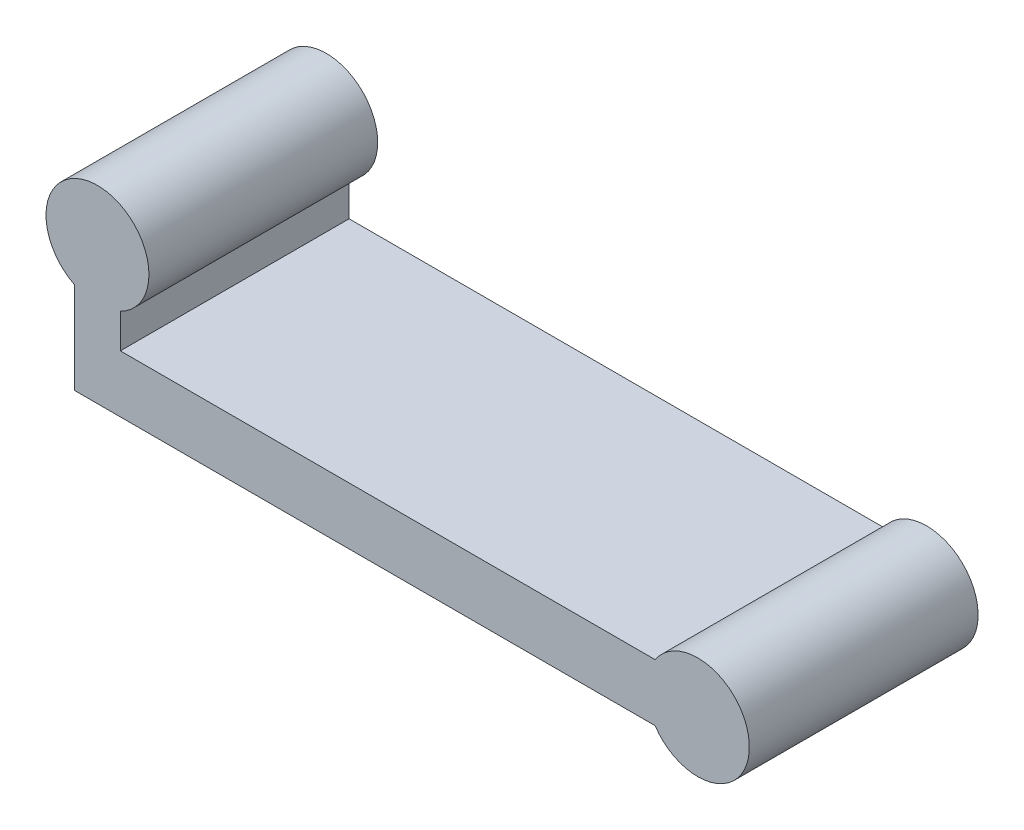
ISO-10303-21;
HEADER;
FILE_DESCRIPTION(('STEP AP214'),'2;1');
FILE_NAME('part.step','',(''),(''),'','','');
FILE_SCHEMA(('AUTOMOTIVE_DESIGN { 1 0 10303 214 1 1 1 1 }'));
ENDSEC;
DATA;
#1=APPLICATION_CONTEXT('core data for automotive mechanical design processes');
#2=APPLICATION_PROTOCOL_DEFINITION('international standard','automotive_design',2000,#1);
#3=PRODUCT_CONTEXT('',#1,'mechanical');
#4=PRODUCT('Part','Part','',(#3));
#5=PRODUCT_RELATED_PRODUCT_CATEGORY('part','',(#4));
#6=PRODUCT_DEFINITION_FORMATION('','',#4);
#7=PRODUCT_DEFINITION_CONTEXT('part definition',#1,'design');
#8=PRODUCT_DEFINITION('design','',#6,#7);
#9=PRODUCT_DEFINITION_SHAPE('','',#8);
#10=(LENGTH_UNIT() NAMED_UNIT(*) SI_UNIT(.MILLI.,.METRE.));
#11=(NAMED_UNIT(*) PLANE_ANGLE_UNIT() SI_UNIT($,.RADIAN.));
#12=(NAMED_UNIT(*) SI_UNIT($,.STERADIAN.) SOLID_ANGLE_UNIT());
#13=UNCERTAINTY_MEASURE_WITH_UNIT(LENGTH_MEASURE(1.E-05),#10,'distance_accuracy_value','');
#14=(GEOMETRIC_REPRESENTATION_CONTEXT(3) GLOBAL_UNCERTAINTY_ASSIGNED_CONTEXT((#13)) GLOBAL_UNIT_ASSIGNED_CONTEXT((#10,
#11,#12)) REPRESENTATION_CONTEXT('',''));
#15=CARTESIAN_POINT('',(0.,0.,0.));
#16=DIRECTION('',(0.,0.,1.));
#17=DIRECTION('',(1.,0.,0.));
#18=AXIS2_PLACEMENT_3D('',#15,#16,#17);
#19=CARTESIAN_POINT('',(0.4,2.40622577482985,4.));
#20=DIRECTION('',(0.,0.,-1.));
#21=DIRECTION('',(-1.,0.,0.));
#22=AXIS2_PLACEMENT_3D('',#19,#20,#21);
#23=CYLINDRICAL_SURFACE('',#22,0.9);
#24=CARTESIAN_POINT('',(0.4,2.40622577482985,0.));
#25=DIRECTION('',(0.,0.,1.));
#26=DIRECTION('',(-1.,0.,0.));
#27=AXIS2_PLACEMENT_3D('',#24,#25,#26);
#28=CIRCLE('',#27,0.9);
#29=CARTESIAN_POINT('',(0.8,1.6,0.));
#30=VERTEX_POINT('',#29);
#31=CARTESIAN_POINT('',(0.,1.6,0.));
#32=VERTEX_POINT('',#31);
#33=EDGE_CURVE('E118',#30,#32,#28,.T.);
#34=ORIENTED_EDGE('',*,*,#33,.T.);
#35=DIRECTION('',(0.,0.,-1.));
#36=VECTOR('',#35,1.);
#37=CARTESIAN_POINT('',(0.,1.6,4.));
#38=LINE('',#37,#36);
#39=CARTESIAN_POINT('',(0.,1.6,4.));
#40=VERTEX_POINT('',#39);
#41=EDGE_CURVE('E11',#40,#32,#38,.T.);
#42=ORIENTED_EDGE('',*,*,#41,.F.);
#43=CARTESIAN_POINT('',(0.4,2.40622577482985,4.));
#44=DIRECTION('',(0.,0.,1.));
#45=DIRECTION('',(-1.,0.,0.));
#46=AXIS2_PLACEMENT_3D('',#43,#44,#45);
#47=CIRCLE('',#46,0.9);
#48=CARTESIAN_POINT('',(0.8,1.6,4.));
#49=VERTEX_POINT('',#48);
#50=EDGE_CURVE('E128',#49,#40,#47,.T.);
#51=ORIENTED_EDGE('',*,*,#50,.F.);
#52=DIRECTION('',(0.,0.,-1.));
#53=VECTOR('',#52,1.);
#54=CARTESIAN_POINT('',(0.8,1.6,4.));
#55=LINE('',#54,#53);
#56=EDGE_CURVE('E114',#49,#30,#55,.T.);
#57=ORIENTED_EDGE('',*,*,#56,.T.);
#58=EDGE_LOOP('',(#34,#42,#51,#57));
#59=FACE_BOUND('',#58,.T.);
#60=ADVANCED_FACE('F34',(#59),#23,.T.);
#61=CARTESIAN_POINT('',(0.,1.6,4.));
#62=DIRECTION('',(1.,0.,0.));
#63=DIRECTION('',(0.,0.,-1.));
#64=AXIS2_PLACEMENT_3D('',#61,#62,#63);
#65=PLANE('',#64);
#66=DIRECTION('',(0.,-1.,0.));
#67=VECTOR('',#66,1.);
#68=CARTESIAN_POINT('',(0.,1.6,0.));
#69=LINE('',#68,#67);
#70=CARTESIAN_POINT('',(0.,0.,0.));
#71=VERTEX_POINT('',#70);
#72=EDGE_CURVE('E121',#32,#71,#69,.T.);
#73=ORIENTED_EDGE('',*,*,#72,.T.);
#74=DIRECTION('',(0.,0.,-1.));
#75=VECTOR('',#74,1.);
#76=CARTESIAN_POINT('',(0.,0.,4.));
#77=LINE('',#76,#75);
#78=CARTESIAN_POINT('',(0.,0.,4.));
#79=VERTEX_POINT('',#78);
#80=EDGE_CURVE('E42',#79,#71,#77,.T.);
#81=ORIENTED_EDGE('',*,*,#80,.F.);
#82=DIRECTION('',(0.,-1.,0.));
#83=VECTOR('',#82,1.);
#84=CARTESIAN_POINT('',(0.,1.6,4.));
#85=LINE('',#84,#83);
#86=EDGE_CURVE('E87',#40,#79,#85,.T.);
#87=ORIENTED_EDGE('',*,*,#86,.F.);
#88=ORIENTED_EDGE('',*,*,#41,.T.);
#89=EDGE_LOOP('',(#73,#81,#87,#88));
#90=FACE_BOUND('',#89,.T.);
#91=ADVANCED_FACE('F152',(#90),#65,.F.);
#92=CARTESIAN_POINT('',(0.,0.,4.));
#93=DIRECTION('',(0.,1.,0.));
#94=DIRECTION('',(0.,0.,1.));
#95=AXIS2_PLACEMENT_3D('',#92,#93,#94);
#96=PLANE('',#95);
#97=DIRECTION('',(1.,0.,0.));
#98=VECTOR('',#97,1.);
#99=CARTESIAN_POINT('',(0.,0.,0.));
#100=LINE('',#99,#98);
#101=CARTESIAN_POINT('',(10.15,0.,0.));
#102=VERTEX_POINT('',#101);
#103=EDGE_CURVE('E123',#71,#102,#100,.T.);
#104=ORIENTED_EDGE('',*,*,#103,.T.);
#105=DIRECTION('',(0.,0.,-1.));
#106=VECTOR('',#105,1.);
#107=CARTESIAN_POINT('',(10.15,0.,4.));
#108=LINE('',#107,#106);
#109=CARTESIAN_POINT('',(10.15,0.,4.));
#110=VERTEX_POINT('',#109);
#111=EDGE_CURVE('E109',#110,#102,#108,.T.);
#112=ORIENTED_EDGE('',*,*,#111,.F.);
#113=DIRECTION('',(1.,0.,0.));
#114=VECTOR('',#113,1.);
#115=CARTESIAN_POINT('',(0.,0.,4.));
#116=LINE('',#115,#114);
#117=EDGE_CURVE('E100',#79,#110,#116,.T.);
#118=ORIENTED_EDGE('',*,*,#117,.F.);
#119=ORIENTED_EDGE('',*,*,#80,.T.);
#120=EDGE_LOOP('',(#104,#112,#118,#119));
#121=FACE_BOUND('',#120,.T.);
#122=ADVANCED_FACE('F134',(#121),#96,.F.);
#123=CARTESIAN_POINT('',(10.8983314773548,0.5,4.));
#124=DIRECTION('',(0.,0.,-1.));
#125=DIRECTION('',(-1.,0.,0.));
#126=AXIS2_PLACEMENT_3D('',#123,#124,#125);
#127=CYLINDRICAL_SURFACE('',#126,0.900000000000001);
#128=CARTESIAN_POINT('',(10.8983314773548,0.5,0.));
#129=DIRECTION('',(0.,0.,1.));
#130=DIRECTION('',(-1.,0.,0.));
#131=AXIS2_PLACEMENT_3D('',#128,#129,#130);
#132=CIRCLE('',#131,0.900000000000001);
#133=CARTESIAN_POINT('',(10.15,1.,0.));
#134=VERTEX_POINT('',#133);
#135=EDGE_CURVE('E108',#102,#134,#132,.T.);
#136=ORIENTED_EDGE('',*,*,#135,.T.);
#137=DIRECTION('',(0.,0.,-1.));
#138=VECTOR('',#137,1.);
#139=CARTESIAN_POINT('',(10.15,1.,4.));
#140=LINE('',#139,#138);
#141=CARTESIAN_POINT('',(10.15,1.,4.));
#142=VERTEX_POINT('',#141);
#143=EDGE_CURVE('E105',#142,#134,#140,.T.);
#144=ORIENTED_EDGE('',*,*,#143,.F.);
#145=CARTESIAN_POINT('',(10.8983314773548,0.5,4.));
#146=DIRECTION('',(0.,0.,1.));
#147=DIRECTION('',(-1.,0.,0.));
#148=AXIS2_PLACEMENT_3D('',#145,#146,#147);
#149=CIRCLE('',#148,0.900000000000001);
#150=EDGE_CURVE('E94',#110,#142,#149,.T.);
#151=ORIENTED_EDGE('',*,*,#150,.F.);
#152=ORIENTED_EDGE('',*,*,#111,.T.);
#153=EDGE_LOOP('',(#136,#144,#151,#152));
#154=FACE_BOUND('',#153,.T.);
#155=ADVANCED_FACE('F106',(#154),#127,.T.);
#156=CARTESIAN_POINT('',(10.15,1.,4.));
#157=DIRECTION('',(0.,-1.,0.));
#158=DIRECTION('',(1.,0.,0.));
#159=AXIS2_PLACEMENT_3D('',#156,#157,#158);
#160=PLANE('',#159);
#161=DIRECTION('',(-1.,0.,0.));
#162=VECTOR('',#161,1.);
#163=CARTESIAN_POINT('',(10.15,1.,0.));
#164=LINE('',#163,#162);
#165=CARTESIAN_POINT('',(0.8,0.999999999999999,0.));
#166=VERTEX_POINT('',#165);
#167=EDGE_CURVE('E73',#134,#166,#164,.T.);
#168=ORIENTED_EDGE('',*,*,#167,.T.);
#169=DIRECTION('',(0.,0.,-1.));
#170=VECTOR('',#169,1.);
#171=CARTESIAN_POINT('',(0.8,0.999999999999999,4.));
#172=LINE('',#171,#170);
#173=CARTESIAN_POINT('',(0.8,0.999999999999999,4.));
#174=VERTEX_POINT('',#173);
#175=EDGE_CURVE('E110',#174,#166,#172,.T.);
#176=ORIENTED_EDGE('',*,*,#175,.F.);
#177=DIRECTION('',(-1.,0.,0.));
#178=VECTOR('',#177,1.);
#179=CARTESIAN_POINT('',(10.15,1.,4.));
#180=LINE('',#179,#178);
#181=EDGE_CURVE('E98',#142,#174,#180,.T.);
#182=ORIENTED_EDGE('',*,*,#181,.F.);
#183=ORIENTED_EDGE('',*,*,#143,.T.);
#184=EDGE_LOOP('',(#168,#176,#182,#183));
#185=FACE_BOUND('',#184,.T.);
#186=ADVANCED_FACE('F112',(#185),#160,.F.);
#187=CARTESIAN_POINT('',(0.8,0.999999999999999,4.));
#188=DIRECTION('',(-1.,0.,0.));
#189=DIRECTION('',(0.,-1.,0.));
#190=AXIS2_PLACEMENT_3D('',#187,#188,#189);
#191=PLANE('',#190);
#192=DIRECTION('',(0.,1.,0.));
#193=VECTOR('',#192,1.);
#194=CARTESIAN_POINT('',(0.8,0.999999999999999,0.));
#195=LINE('',#194,#193);
#196=EDGE_CURVE('E79',#166,#30,#195,.T.);
#197=ORIENTED_EDGE('',*,*,#196,.T.);
#198=ORIENTED_EDGE('',*,*,#56,.F.);
#199=DIRECTION('',(0.,1.,0.));
#200=VECTOR('',#199,1.);
#201=CARTESIAN_POINT('',(0.8,0.999999999999999,4.));
#202=LINE('',#201,#200);
#203=EDGE_CURVE('E50',#174,#49,#202,.T.);
#204=ORIENTED_EDGE('',*,*,#203,.F.);
#205=ORIENTED_EDGE('',*,*,#175,.T.);
#206=EDGE_LOOP('',(#197,#198,#204,#205));
#207=FACE_BOUND('',#206,.T.);
#208=ADVANCED_FACE('F141',(#207),#191,.F.);
#209=CARTESIAN_POINT('',(0.4,2.40622577482985,4.));
#210=DIRECTION('',(0.,0.,-1.));
#211=DIRECTION('',(-1.,0.,0.));
#212=AXIS2_PLACEMENT_3D('',#209,#210,#211);
#213=PLANE('',#212);
#214=ORIENTED_EDGE('',*,*,#50,.T.);
#215=ORIENTED_EDGE('',*,*,#86,.T.);
#216=ORIENTED_EDGE('',*,*,#117,.T.);
#217=ORIENTED_EDGE('',*,*,#150,.T.);
#218=ORIENTED_EDGE('',*,*,#181,.T.);
#219=ORIENTED_EDGE('',*,*,#203,.T.);
#220=EDGE_LOOP('',(#214,#215,#216,#217,#218,#219));
#221=FACE_BOUND('',#220,.T.);
#222=ADVANCED_FACE('F96',(#221),#213,.F.);
#223=CARTESIAN_POINT('',(0.4,2.40622577482985,0.));
#224=DIRECTION('',(0.,0.,-1.));
#225=DIRECTION('',(-1.,0.,0.));
#226=AXIS2_PLACEMENT_3D('',#223,#224,#225);
#227=PLANE('',#226);
#228=ORIENTED_EDGE('',*,*,#33,.F.);
#229=ORIENTED_EDGE('',*,*,#196,.F.);
#230=ORIENTED_EDGE('',*,*,#167,.F.);
#231=ORIENTED_EDGE('',*,*,#135,.F.);
#232=ORIENTED_EDGE('',*,*,#103,.F.);
#233=ORIENTED_EDGE('',*,*,#72,.F.);
#234=EDGE_LOOP('',(#228,#229,#230,#231,#232,#233));
#235=FACE_BOUND('',#234,.T.);
#236=ADVANCED_FACE('F137',(#235),#227,.T.);
#237=CLOSED_SHELL('',(#60,#91,#122,#155,#186,#208,#222,#236));
#238=MANIFOLD_SOLID_BREP('B2',#237);
#239=ADVANCED_BREP_SHAPE_REPRESENTATION('',(#18,#238),#14);
#240=SHAPE_DEFINITION_REPRESENTATION(#9,#239);
ENDSEC;
END-ISO-10303-21;
